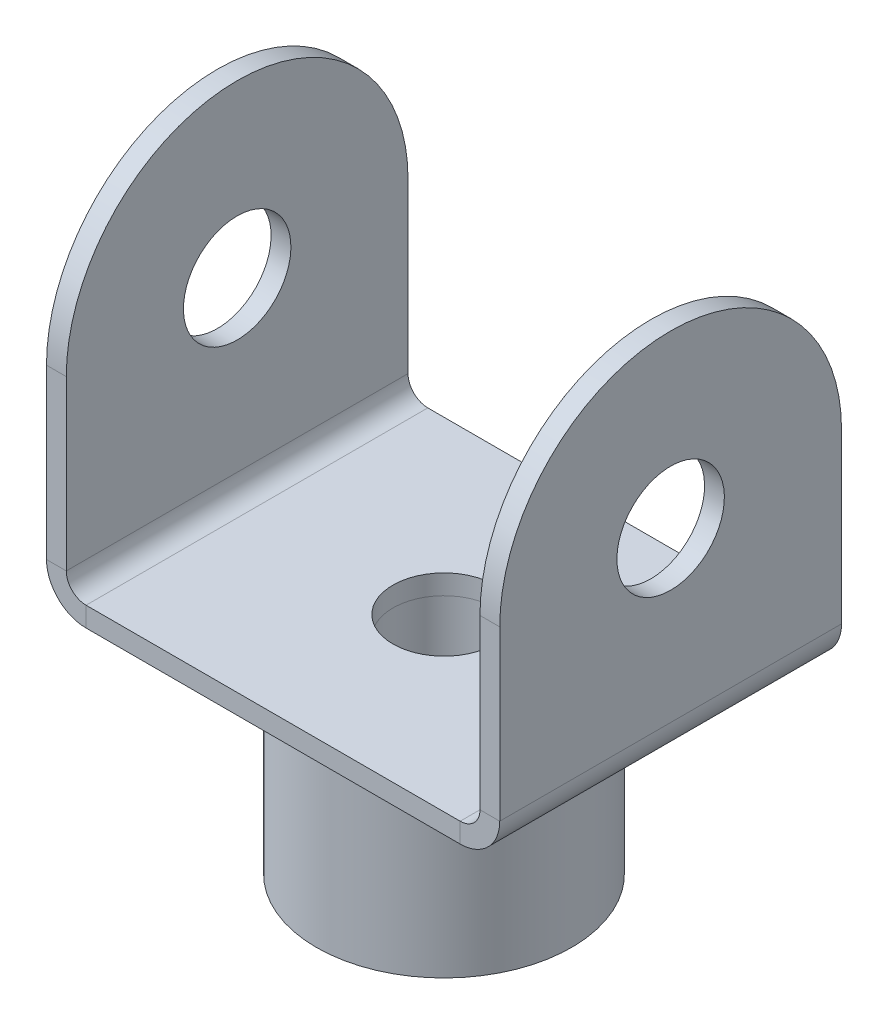
ISO-10303-21;
HEADER;
FILE_DESCRIPTION(('STEP AP214'),'2;1');
FILE_NAME('part.step','',(''),(''),'','','');
FILE_SCHEMA(('AUTOMOTIVE_DESIGN { 1 0 10303 214 1 1 1 1 }'));
ENDSEC;
DATA;
#1=APPLICATION_CONTEXT('core data for automotive mechanical design processes');
#2=APPLICATION_PROTOCOL_DEFINITION('international standard','automotive_design',2000,#1);
#3=PRODUCT_CONTEXT('',#1,'mechanical');
#4=PRODUCT('Part','Part','',(#3));
#5=PRODUCT_RELATED_PRODUCT_CATEGORY('part','',(#4));
#6=PRODUCT_DEFINITION_FORMATION('','',#4);
#7=PRODUCT_DEFINITION_CONTEXT('part definition',#1,'design');
#8=PRODUCT_DEFINITION('design','',#6,#7);
#9=PRODUCT_DEFINITION_SHAPE('','',#8);
#10=(LENGTH_UNIT() NAMED_UNIT(*) SI_UNIT(.MILLI.,.METRE.));
#11=(NAMED_UNIT(*) PLANE_ANGLE_UNIT() SI_UNIT($,.RADIAN.));
#12=(NAMED_UNIT(*) SI_UNIT($,.STERADIAN.) SOLID_ANGLE_UNIT());
#13=UNCERTAINTY_MEASURE_WITH_UNIT(LENGTH_MEASURE(1.E-05),#10,'distance_accuracy_value','');
#14=(GEOMETRIC_REPRESENTATION_CONTEXT(3) GLOBAL_UNCERTAINTY_ASSIGNED_CONTEXT((#13)) GLOBAL_UNIT_ASSIGNED_CONTEXT((#10,
#11,#12)) REPRESENTATION_CONTEXT('',''));
#15=CARTESIAN_POINT('',(0.,0.,0.));
#16=DIRECTION('',(0.,0.,1.));
#17=DIRECTION('',(1.,0.,0.));
#18=AXIS2_PLACEMENT_3D('',#15,#16,#17);
#19=CARTESIAN_POINT('',(0.,8.3566,0.));
#20=DIRECTION('',(0.,-1.,0.));
#21=DIRECTION('',(0.,0.,-1.));
#22=AXIS2_PLACEMENT_3D('',#19,#20,#21);
#23=PLANE('',#22);
#24=CARTESIAN_POINT('',(0.,8.3566,0.));
#25=DIRECTION('',(0.,1.,0.));
#26=DIRECTION('',(0.,0.,1.));
#27=AXIS2_PLACEMENT_3D('',#24,#25,#26);
#28=CIRCLE('',#27,1.9);
#29=CARTESIAN_POINT('',(0.,8.3566,1.9));
#30=VERTEX_POINT('',#29);
#31=EDGE_CURVE('E301',#30,#30,#28,.T.);
#32=ORIENTED_EDGE('',*,*,#31,.F.);
#33=EDGE_LOOP('',(#32));
#34=FACE_BOUND('',#33,.T.);
#35=DIRECTION('',(0.,0.,-1.));
#36=VECTOR('',#35,1.);
#37=CARTESIAN_POINT('',(6.9618,8.35659999999999,-6.36));
#38=LINE('',#37,#36);
#39=CARTESIAN_POINT('',(6.9618,8.35659999999999,-6.36));
#40=VERTEX_POINT('',#39);
#41=CARTESIAN_POINT('',(6.9618,8.35660000000001,6.36));
#42=VERTEX_POINT('',#41);
#43=EDGE_CURVE('E232',#40,#42,#38,.F.);
#44=ORIENTED_EDGE('',*,*,#43,.F.);
#45=DIRECTION('',(-1.,0.,0.));
#46=VECTOR('',#45,1.);
#47=CARTESIAN_POINT('',(7.435,8.3566,-6.36));
#48=LINE('',#47,#46);
#49=CARTESIAN_POINT('',(-6.9618,8.35660000000001,-6.36));
#50=VERTEX_POINT('',#49);
#51=EDGE_CURVE('E14',#40,#50,#48,.T.);
#52=ORIENTED_EDGE('',*,*,#51,.T.);
#53=DIRECTION('',(0.,0.,1.));
#54=VECTOR('',#53,1.);
#55=CARTESIAN_POINT('',(-6.9618,8.35659999999999,6.36));
#56=LINE('',#55,#54);
#57=CARTESIAN_POINT('',(-6.9618,8.35659999999999,6.36));
#58=VERTEX_POINT('',#57);
#59=EDGE_CURVE('E290',#58,#50,#56,.F.);
#60=ORIENTED_EDGE('',*,*,#59,.F.);
#61=DIRECTION('',(1.,0.,0.));
#62=VECTOR('',#61,1.);
#63=CARTESIAN_POINT('',(7.435,8.3566,6.36));
#64=LINE('',#63,#62);
#65=EDGE_CURVE('E91',#58,#42,#64,.T.);
#66=ORIENTED_EDGE('',*,*,#65,.T.);
#67=EDGE_LOOP('',(#44,#52,#60,#66));
#68=FACE_BOUND('',#67,.T.);
#69=ADVANCED_FACE('F82',(#34,#68),#23,.F.);
#70=CARTESIAN_POINT('',(0.,7.62,0.));
#71=DIRECTION('',(0.,-1.,0.));
#72=DIRECTION('',(0.,0.,-1.));
#73=AXIS2_PLACEMENT_3D('',#70,#71,#72);
#74=PLANE('',#73);
#75=CARTESIAN_POINT('',(0.,7.62,0.));
#76=DIRECTION('',(0.,1.,0.));
#77=DIRECTION('',(0.,0.,1.));
#78=AXIS2_PLACEMENT_3D('',#75,#76,#77);
#79=CIRCLE('',#78,1.9);
#80=CARTESIAN_POINT('',(0.,7.62,1.9));
#81=VERTEX_POINT('',#80);
#82=EDGE_CURVE('E298',#81,#81,#79,.T.);
#83=ORIENTED_EDGE('',*,*,#82,.T.);
#84=EDGE_LOOP('',(#83));
#85=FACE_BOUND('',#84,.T.);
#86=DIRECTION('',(-1.,0.,0.));
#87=VECTOR('',#86,1.);
#88=CARTESIAN_POINT('',(7.435,7.62,-6.36));
#89=LINE('',#88,#87);
#90=CARTESIAN_POINT('',(6.9618,7.61999999999999,-6.36));
#91=VERTEX_POINT('',#90);
#92=CARTESIAN_POINT('',(-6.9618,7.62,-6.36));
#93=VERTEX_POINT('',#92);
#94=EDGE_CURVE('E86',#91,#93,#89,.T.);
#95=ORIENTED_EDGE('',*,*,#94,.F.);
#96=DIRECTION('',(0.,0.,-1.));
#97=VECTOR('',#96,1.);
#98=CARTESIAN_POINT('',(6.9618,7.61999999999999,-6.36));
#99=LINE('',#98,#97);
#100=CARTESIAN_POINT('',(6.9618,7.62,6.36));
#101=VERTEX_POINT('',#100);
#102=EDGE_CURVE('E221',#91,#101,#99,.F.);
#103=ORIENTED_EDGE('',*,*,#102,.T.);
#104=DIRECTION('',(1.,0.,0.));
#105=VECTOR('',#104,1.);
#106=CARTESIAN_POINT('',(7.435,7.62,6.36));
#107=LINE('',#106,#105);
#108=CARTESIAN_POINT('',(-6.9618,7.61999999999999,6.36));
#109=VERTEX_POINT('',#108);
#110=EDGE_CURVE('E304',#109,#101,#107,.T.);
#111=ORIENTED_EDGE('',*,*,#110,.F.);
#112=DIRECTION('',(0.,0.,1.));
#113=VECTOR('',#112,1.);
#114=CARTESIAN_POINT('',(-6.9618,7.61999999999999,6.36));
#115=LINE('',#114,#113);
#116=EDGE_CURVE('E277',#109,#93,#115,.F.);
#117=ORIENTED_EDGE('',*,*,#116,.T.);
#118=EDGE_LOOP('',(#95,#103,#111,#117));
#119=FACE_BOUND('',#118,.T.);
#120=ADVANCED_FACE('F314',(#85,#119),#74,.T.);
#121=CARTESIAN_POINT('',(7.435,8.3566,6.36));
#122=DIRECTION('',(0.,0.,-1.));
#123=DIRECTION('',(-1.,0.,0.));
#124=AXIS2_PLACEMENT_3D('',#121,#122,#123);
#125=PLANE('',#124);
#126=DIRECTION('',(0.,-1.,0.));
#127=VECTOR('',#126,1.);
#128=CARTESIAN_POINT('',(6.9618,8.35660000000001,6.36));
#129=LINE('',#128,#127);
#130=EDGE_CURVE('E237',#42,#101,#129,.T.);
#131=ORIENTED_EDGE('',*,*,#130,.F.);
#132=ORIENTED_EDGE('',*,*,#65,.F.);
#133=DIRECTION('',(0.,-1.,0.));
#134=VECTOR('',#133,1.);
#135=CARTESIAN_POINT('',(-6.9618,8.35659999999999,6.36));
#136=LINE('',#135,#134);
#137=EDGE_CURVE('E284',#58,#109,#136,.T.);
#138=ORIENTED_EDGE('',*,*,#137,.T.);
#139=ORIENTED_EDGE('',*,*,#110,.T.);
#140=EDGE_LOOP('',(#131,#132,#138,#139));
#141=FACE_BOUND('',#140,.T.);
#142=ADVANCED_FACE('F84',(#141),#125,.F.);
#143=CARTESIAN_POINT('',(7.435,8.3566,-6.36));
#144=DIRECTION('',(0.,0.,1.));
#145=DIRECTION('',(1.,0.,0.));
#146=AXIS2_PLACEMENT_3D('',#143,#144,#145);
#147=PLANE('',#146);
#148=DIRECTION('',(0.,-1.,0.));
#149=VECTOR('',#148,1.);
#150=CARTESIAN_POINT('',(6.9618,8.35659999999999,-6.36));
#151=LINE('',#150,#149);
#152=EDGE_CURVE('E226',#40,#91,#151,.T.);
#153=ORIENTED_EDGE('',*,*,#152,.T.);
#154=ORIENTED_EDGE('',*,*,#94,.T.);
#155=DIRECTION('',(0.,-1.,0.));
#156=VECTOR('',#155,1.);
#157=CARTESIAN_POINT('',(-6.9618,8.35660000000001,-6.36));
#158=LINE('',#157,#156);
#159=EDGE_CURVE('E295',#50,#93,#158,.T.);
#160=ORIENTED_EDGE('',*,*,#159,.F.);
#161=ORIENTED_EDGE('',*,*,#51,.F.);
#162=EDGE_LOOP('',(#153,#154,#160,#161));
#163=FACE_BOUND('',#162,.T.);
#164=ADVANCED_FACE('F321',(#163),#147,.F.);
#165=CARTESIAN_POINT('',(0.,8.3566,0.));
#166=DIRECTION('',(0.,-1.,0.));
#167=DIRECTION('',(0.,0.,-1.));
#168=AXIS2_PLACEMENT_3D('',#165,#166,#167);
#169=CYLINDRICAL_SURFACE('',#168,1.9);
#170=ORIENTED_EDGE('',*,*,#31,.T.);
#171=EDGE_LOOP('',(#170));
#172=FACE_BOUND('',#171,.T.);
#173=ORIENTED_EDGE('',*,*,#82,.F.);
#174=EDGE_LOOP('',(#173));
#175=FACE_BOUND('',#174,.T.);
#176=ADVANCED_FACE('F353',(#172,#175),#169,.F.);
#177=CARTESIAN_POINT('',(-6.9618,9.09320000000001,-6.36));
#178=DIRECTION('',(0.,0.,-1.));
#179=DIRECTION('',(0.,1.,0.));
#180=AXIS2_PLACEMENT_3D('',#177,#178,#179);
#181=PLANE('',#180);
#182=DIRECTION('',(1.,0.,0.));
#183=VECTOR('',#182,1.);
#184=CARTESIAN_POINT('',(-8.435,9.0932,-6.36));
#185=LINE('',#184,#183);
#186=CARTESIAN_POINT('',(-7.6984,9.09320000000001,-6.36));
#187=VERTEX_POINT('',#186);
#188=CARTESIAN_POINT('',(-8.43500000000001,9.09320000000001,-6.36));
#189=VERTEX_POINT('',#188);
#190=EDGE_CURVE('E239',#187,#189,#185,.F.);
#191=ORIENTED_EDGE('',*,*,#190,.F.);
#192=CARTESIAN_POINT('',(-6.9618,9.09320000000001,-6.36));
#193=DIRECTION('',(0.,0.,1.));
#194=DIRECTION('',(0.,-1.,0.));
#195=AXIS2_PLACEMENT_3D('',#192,#193,#194);
#196=CIRCLE('',#195,0.736600000000001);
#197=EDGE_CURVE('E287',#50,#187,#196,.F.);
#198=ORIENTED_EDGE('',*,*,#197,.F.);
#199=ORIENTED_EDGE('',*,*,#159,.T.);
#200=CARTESIAN_POINT('',(-6.9618,9.09320000000001,-6.36));
#201=DIRECTION('',(0.,0.,1.));
#202=DIRECTION('',(0.,-1.,0.));
#203=AXIS2_PLACEMENT_3D('',#200,#201,#202);
#204=CIRCLE('',#203,1.4732);
#205=EDGE_CURVE('E280',#93,#189,#204,.F.);
#206=ORIENTED_EDGE('',*,*,#205,.T.);
#207=EDGE_LOOP('',(#191,#198,#199,#206));
#208=FACE_BOUND('',#207,.T.);
#209=ADVANCED_FACE('F360',(#208),#181,.T.);
#210=CARTESIAN_POINT('',(-6.9618,9.09319999999999,6.36));
#211=DIRECTION('',(0.,0.,-1.));
#212=DIRECTION('',(0.,1.,0.));
#213=AXIS2_PLACEMENT_3D('',#210,#211,#212);
#214=PLANE('',#213);
#215=CARTESIAN_POINT('',(-6.9618,9.09319999999999,6.36));
#216=DIRECTION('',(0.,0.,1.));
#217=DIRECTION('',(0.,-1.,0.));
#218=AXIS2_PLACEMENT_3D('',#215,#216,#217);
#219=CIRCLE('',#218,0.736600000000001);
#220=CARTESIAN_POINT('',(-7.6984,9.09319999999999,6.36));
#221=VERTEX_POINT('',#220);
#222=EDGE_CURVE('E248',#221,#58,#219,.T.);
#223=ORIENTED_EDGE('',*,*,#222,.F.);
#224=DIRECTION('',(1.,0.,0.));
#225=VECTOR('',#224,1.);
#226=CARTESIAN_POINT('',(-7.6984,9.0932,6.36));
#227=LINE('',#226,#225);
#228=CARTESIAN_POINT('',(-8.435,9.09319999999999,6.36));
#229=VERTEX_POINT('',#228);
#230=EDGE_CURVE('E270',#221,#229,#227,.F.);
#231=ORIENTED_EDGE('',*,*,#230,.T.);
#232=CARTESIAN_POINT('',(-6.9618,9.09319999999999,6.36));
#233=DIRECTION('',(0.,0.,1.));
#234=DIRECTION('',(0.,-1.,0.));
#235=AXIS2_PLACEMENT_3D('',#232,#233,#234);
#236=CIRCLE('',#235,1.4732);
#237=EDGE_CURVE('E281',#229,#109,#236,.T.);
#238=ORIENTED_EDGE('',*,*,#237,.T.);
#239=ORIENTED_EDGE('',*,*,#137,.F.);
#240=EDGE_LOOP('',(#223,#231,#238,#239));
#241=FACE_BOUND('',#240,.T.);
#242=ADVANCED_FACE('F458',(#241),#214,.F.);
#243=CARTESIAN_POINT('',(-6.9618,9.09319999999999,6.36));
#244=DIRECTION('',(0.,0.,1.));
#245=DIRECTION('',(-1.,0.,0.));
#246=AXIS2_PLACEMENT_3D('',#243,#244,#245);
#247=CYLINDRICAL_SURFACE('',#246,1.4732);
#248=ORIENTED_EDGE('',*,*,#116,.F.);
#249=ORIENTED_EDGE('',*,*,#237,.F.);
#250=DIRECTION('',(0.,0.,1.));
#251=VECTOR('',#250,1.);
#252=CARTESIAN_POINT('',(-8.43500000000001,9.0932,-6.36));
#253=LINE('',#252,#251);
#254=EDGE_CURVE('E268',#229,#189,#253,.F.);
#255=ORIENTED_EDGE('',*,*,#254,.T.);
#256=ORIENTED_EDGE('',*,*,#205,.F.);
#257=EDGE_LOOP('',(#248,#249,#255,#256));
#258=FACE_BOUND('',#257,.T.);
#259=ADVANCED_FACE('F447',(#258),#247,.T.);
#260=CARTESIAN_POINT('',(-6.9618,9.09319999999999,6.36));
#261=DIRECTION('',(0.,0.,1.));
#262=DIRECTION('',(-1.,0.,0.));
#263=AXIS2_PLACEMENT_3D('',#260,#261,#262);
#264=CYLINDRICAL_SURFACE('',#263,0.736600000000001);
#265=ORIENTED_EDGE('',*,*,#59,.T.);
#266=ORIENTED_EDGE('',*,*,#197,.T.);
#267=DIRECTION('',(0.,0.,1.));
#268=VECTOR('',#267,1.);
#269=CARTESIAN_POINT('',(-7.6984,9.0932,-6.36));
#270=LINE('',#269,#268);
#271=EDGE_CURVE('E273',#187,#221,#270,.T.);
#272=ORIENTED_EDGE('',*,*,#271,.T.);
#273=ORIENTED_EDGE('',*,*,#222,.T.);
#274=EDGE_LOOP('',(#265,#266,#272,#273));
#275=FACE_BOUND('',#274,.T.);
#276=ADVANCED_FACE('F436',(#275),#264,.F.);
#277=CARTESIAN_POINT('',(-8.43500000000003,15.3566,0.));
#278=DIRECTION('',(1.,0.,0.));
#279=DIRECTION('',(0.,1.,0.));
#280=AXIS2_PLACEMENT_3D('',#277,#278,#279);
#281=PLANE('',#280);
#282=CARTESIAN_POINT('',(-8.43500000000003,15.3566,0.));
#283=DIRECTION('',(1.,0.,0.));
#284=DIRECTION('',(0.,1.,0.));
#285=AXIS2_PLACEMENT_3D('',#282,#283,#284);
#286=CIRCLE('',#285,2.);
#287=CARTESIAN_POINT('',(-8.43500000000003,17.3566,0.));
#288=VERTEX_POINT('',#287);
#289=EDGE_CURVE('E262',#288,#288,#286,.F.);
#290=ORIENTED_EDGE('',*,*,#289,.F.);
#291=EDGE_LOOP('',(#290));
#292=FACE_BOUND('',#291,.T.);
#293=ORIENTED_EDGE('',*,*,#254,.F.);
#294=DIRECTION('',(0.,1.,0.));
#295=VECTOR('',#294,1.);
#296=CARTESIAN_POINT('',(-8.43500000000003,15.3566,6.36));
#297=LINE('',#296,#295);
#298=CARTESIAN_POINT('',(-8.43500000000003,15.3566,6.36));
#299=VERTEX_POINT('',#298);
#300=EDGE_CURVE('E250',#229,#299,#297,.T.);
#301=ORIENTED_EDGE('',*,*,#300,.T.);
#302=CARTESIAN_POINT('',(-8.43500000000003,15.3566,0.));
#303=DIRECTION('',(1.,0.,0.));
#304=DIRECTION('',(0.,1.,0.));
#305=AXIS2_PLACEMENT_3D('',#302,#303,#304);
#306=CIRCLE('',#305,6.36);
#307=CARTESIAN_POINT('',(-8.43500000000003,15.3566,-6.36));
#308=VERTEX_POINT('',#307);
#309=EDGE_CURVE('E245',#299,#308,#306,.F.);
#310=ORIENTED_EDGE('',*,*,#309,.T.);
#311=DIRECTION('',(0.,-1.,0.));
#312=VECTOR('',#311,1.);
#313=CARTESIAN_POINT('',(-8.43500000000003,15.3566,-6.36));
#314=LINE('',#313,#312);
#315=EDGE_CURVE('E252',#308,#189,#314,.T.);
#316=ORIENTED_EDGE('',*,*,#315,.T.);
#317=EDGE_LOOP('',(#293,#301,#310,#316));
#318=FACE_BOUND('',#317,.T.);
#319=ADVANCED_FACE('F425',(#292,#318),#281,.F.);
#320=CARTESIAN_POINT('',(-7.69840000000003,15.3566,0.));
#321=DIRECTION('',(1.,0.,0.));
#322=DIRECTION('',(0.,1.,0.));
#323=AXIS2_PLACEMENT_3D('',#320,#321,#322);
#324=PLANE('',#323);
#325=CARTESIAN_POINT('',(-7.69840000000003,15.3566,0.));
#326=DIRECTION('',(1.,0.,0.));
#327=DIRECTION('',(0.,1.,0.));
#328=AXIS2_PLACEMENT_3D('',#325,#326,#327);
#329=CIRCLE('',#328,2.);
#330=CARTESIAN_POINT('',(-7.69840000000003,17.3566,0.));
#331=VERTEX_POINT('',#330);
#332=EDGE_CURVE('E265',#331,#331,#329,.F.);
#333=ORIENTED_EDGE('',*,*,#332,.T.);
#334=EDGE_LOOP('',(#333));
#335=FACE_BOUND('',#334,.T.);
#336=DIRECTION('',(0.,-1.,0.));
#337=VECTOR('',#336,1.);
#338=CARTESIAN_POINT('',(-7.69840000000002,15.3566,6.36));
#339=LINE('',#338,#337);
#340=CARTESIAN_POINT('',(-7.69840000000002,15.3566,6.36));
#341=VERTEX_POINT('',#340);
#342=EDGE_CURVE('E257',#221,#341,#339,.F.);
#343=ORIENTED_EDGE('',*,*,#342,.F.);
#344=ORIENTED_EDGE('',*,*,#271,.F.);
#345=DIRECTION('',(0.,1.,0.));
#346=VECTOR('',#345,1.);
#347=CARTESIAN_POINT('',(-7.6984,8.3566,-6.36));
#348=LINE('',#347,#346);
#349=CARTESIAN_POINT('',(-7.69840000000003,15.3566,-6.36));
#350=VERTEX_POINT('',#349);
#351=EDGE_CURVE('E259',#350,#187,#348,.F.);
#352=ORIENTED_EDGE('',*,*,#351,.F.);
#353=CARTESIAN_POINT('',(-7.69840000000003,15.3566,0.));
#354=DIRECTION('',(1.,0.,0.));
#355=DIRECTION('',(0.,1.,0.));
#356=AXIS2_PLACEMENT_3D('',#353,#354,#355);
#357=CIRCLE('',#356,6.36);
#358=EDGE_CURVE('E255',#341,#350,#357,.F.);
#359=ORIENTED_EDGE('',*,*,#358,.F.);
#360=EDGE_LOOP('',(#343,#344,#352,#359));
#361=FACE_BOUND('',#360,.T.);
#362=ADVANCED_FACE('F414',(#335,#361),#324,.T.);
#363=CARTESIAN_POINT('',(-8.435,8.3566,-6.36));
#364=DIRECTION('',(0.,0.,1.));
#365=DIRECTION('',(1.,0.,0.));
#366=AXIS2_PLACEMENT_3D('',#363,#364,#365);
#367=PLANE('',#366);
#368=ORIENTED_EDGE('',*,*,#190,.T.);
#369=ORIENTED_EDGE('',*,*,#315,.F.);
#370=DIRECTION('',(1.,0.,0.));
#371=VECTOR('',#370,1.);
#372=CARTESIAN_POINT('',(-8.43500000000003,15.3566,-6.36));
#373=LINE('',#372,#371);
#374=EDGE_CURVE('E241',#308,#350,#373,.T.);
#375=ORIENTED_EDGE('',*,*,#374,.T.);
#376=ORIENTED_EDGE('',*,*,#351,.T.);
#377=EDGE_LOOP('',(#368,#369,#375,#376));
#378=FACE_BOUND('',#377,.T.);
#379=ADVANCED_FACE('F403',(#378),#367,.F.);
#380=CARTESIAN_POINT('',(-8.43500000000002,15.3566,6.36));
#381=DIRECTION('',(0.,0.,-1.));
#382=DIRECTION('',(-1.,0.,0.));
#383=AXIS2_PLACEMENT_3D('',#380,#381,#382);
#384=PLANE('',#383);
#385=ORIENTED_EDGE('',*,*,#230,.F.);
#386=ORIENTED_EDGE('',*,*,#342,.T.);
#387=DIRECTION('',(1.,0.,0.));
#388=VECTOR('',#387,1.);
#389=CARTESIAN_POINT('',(-8.43500000000002,15.3566,6.36));
#390=LINE('',#389,#388);
#391=EDGE_CURVE('E244',#299,#341,#390,.T.);
#392=ORIENTED_EDGE('',*,*,#391,.F.);
#393=ORIENTED_EDGE('',*,*,#300,.F.);
#394=EDGE_LOOP('',(#385,#386,#392,#393));
#395=FACE_BOUND('',#394,.T.);
#396=ADVANCED_FACE('F392',(#395),#384,.F.);
#397=CARTESIAN_POINT('',(-8.43500000000003,15.3566,0.));
#398=DIRECTION('',(1.,0.,0.));
#399=DIRECTION('',(0.,1.,0.));
#400=AXIS2_PLACEMENT_3D('',#397,#398,#399);
#401=CYLINDRICAL_SURFACE('',#400,6.36);
#402=ORIENTED_EDGE('',*,*,#358,.T.);
#403=ORIENTED_EDGE('',*,*,#374,.F.);
#404=ORIENTED_EDGE('',*,*,#309,.F.);
#405=ORIENTED_EDGE('',*,*,#391,.T.);
#406=EDGE_LOOP('',(#402,#403,#404,#405));
#407=FACE_BOUND('',#406,.T.);
#408=ADVANCED_FACE('F339',(#407),#401,.T.);
#409=CARTESIAN_POINT('',(-8.43500000000003,15.3566,0.));
#410=DIRECTION('',(1.,0.,0.));
#411=DIRECTION('',(0.,1.,0.));
#412=AXIS2_PLACEMENT_3D('',#409,#410,#411);
#413=CYLINDRICAL_SURFACE('',#412,2.);
#414=ORIENTED_EDGE('',*,*,#289,.T.);
#415=EDGE_LOOP('',(#414));
#416=FACE_BOUND('',#415,.T.);
#417=ORIENTED_EDGE('',*,*,#332,.F.);
#418=EDGE_LOOP('',(#417));
#419=FACE_BOUND('',#418,.T.);
#420=ADVANCED_FACE('F332',(#416,#419),#413,.F.);
#421=CARTESIAN_POINT('',(6.9618,9.09320000000001,6.36));
#422=DIRECTION('',(0.,0.,1.));
#423=DIRECTION('',(0.,-1.,0.));
#424=AXIS2_PLACEMENT_3D('',#421,#422,#423);
#425=PLANE('',#424);
#426=DIRECTION('',(1.,0.,0.));
#427=VECTOR('',#426,1.);
#428=CARTESIAN_POINT('',(8.435,9.0932,6.36));
#429=LINE('',#428,#427);
#430=CARTESIAN_POINT('',(7.6984,9.09320000000001,6.36));
#431=VERTEX_POINT('',#430);
#432=CARTESIAN_POINT('',(8.435,9.09320000000001,6.36));
#433=VERTEX_POINT('',#432);
#434=EDGE_CURVE('E180',#431,#433,#429,.T.);
#435=ORIENTED_EDGE('',*,*,#434,.F.);
#436=CARTESIAN_POINT('',(6.9618,9.09320000000001,6.36));
#437=DIRECTION('',(0.,0.,-1.));
#438=DIRECTION('',(0.,1.,0.));
#439=AXIS2_PLACEMENT_3D('',#436,#437,#438);
#440=CIRCLE('',#439,0.7366);
#441=EDGE_CURVE('E229',#42,#431,#440,.F.);
#442=ORIENTED_EDGE('',*,*,#441,.F.);
#443=ORIENTED_EDGE('',*,*,#130,.T.);
#444=CARTESIAN_POINT('',(6.9618,9.09320000000001,6.36));
#445=DIRECTION('',(0.,0.,-1.));
#446=DIRECTION('',(0.,1.,0.));
#447=AXIS2_PLACEMENT_3D('',#444,#445,#446);
#448=CIRCLE('',#447,1.4732);
#449=EDGE_CURVE('E99',#101,#433,#448,.F.);
#450=ORIENTED_EDGE('',*,*,#449,.T.);
#451=EDGE_LOOP('',(#435,#442,#443,#450));
#452=FACE_BOUND('',#451,.T.);
#453=ADVANCED_FACE('F330',(#452),#425,.T.);
#454=CARTESIAN_POINT('',(6.9618,9.09319999999999,-6.36));
#455=DIRECTION('',(0.,0.,1.));
#456=DIRECTION('',(0.,-1.,0.));
#457=AXIS2_PLACEMENT_3D('',#454,#455,#456);
#458=PLANE('',#457);
#459=CARTESIAN_POINT('',(6.9618,9.09319999999999,-6.36));
#460=DIRECTION('',(0.,0.,-1.));
#461=DIRECTION('',(0.,1.,0.));
#462=AXIS2_PLACEMENT_3D('',#459,#460,#461);
#463=CIRCLE('',#462,0.7366);
#464=CARTESIAN_POINT('',(7.6984,9.09319999999999,-6.36));
#465=VERTEX_POINT('',#464);
#466=EDGE_CURVE('E234',#465,#40,#463,.T.);
#467=ORIENTED_EDGE('',*,*,#466,.F.);
#468=DIRECTION('',(1.,0.,0.));
#469=VECTOR('',#468,1.);
#470=CARTESIAN_POINT('',(7.6984,9.0932,-6.36));
#471=LINE('',#470,#469);
#472=CARTESIAN_POINT('',(8.43500000000001,9.09319999999999,-6.36));
#473=VERTEX_POINT('',#472);
#474=EDGE_CURVE('E215',#465,#473,#471,.T.);
#475=ORIENTED_EDGE('',*,*,#474,.T.);
#476=CARTESIAN_POINT('',(6.9618,9.09319999999999,-6.36));
#477=DIRECTION('',(0.,0.,-1.));
#478=DIRECTION('',(0.,1.,0.));
#479=AXIS2_PLACEMENT_3D('',#476,#477,#478);
#480=CIRCLE('',#479,1.4732);
#481=EDGE_CURVE('E224',#473,#91,#480,.T.);
#482=ORIENTED_EDGE('',*,*,#481,.T.);
#483=ORIENTED_EDGE('',*,*,#152,.F.);
#484=EDGE_LOOP('',(#467,#475,#482,#483));
#485=FACE_BOUND('',#484,.T.);
#486=ADVANCED_FACE('F318',(#485),#458,.F.);
#487=CARTESIAN_POINT('',(6.9618,9.09319999999999,-6.36));
#488=DIRECTION('',(0.,0.,-1.));
#489=DIRECTION('',(1.,0.,0.));
#490=AXIS2_PLACEMENT_3D('',#487,#488,#489);
#491=CYLINDRICAL_SURFACE('',#490,1.4732);
#492=ORIENTED_EDGE('',*,*,#102,.F.);
#493=ORIENTED_EDGE('',*,*,#481,.F.);
#494=DIRECTION('',(0.,0.,-1.));
#495=VECTOR('',#494,1.);
#496=CARTESIAN_POINT('',(8.435,9.0932,6.36));
#497=LINE('',#496,#495);
#498=EDGE_CURVE('E213',#473,#433,#497,.F.);
#499=ORIENTED_EDGE('',*,*,#498,.T.);
#500=ORIENTED_EDGE('',*,*,#449,.F.);
#501=EDGE_LOOP('',(#492,#493,#499,#500));
#502=FACE_BOUND('',#501,.T.);
#503=ADVANCED_FACE('F315',(#502),#491,.T.);
#504=CARTESIAN_POINT('',(6.9618,9.09319999999999,-6.36));
#505=DIRECTION('',(0.,0.,-1.));
#506=DIRECTION('',(1.,0.,0.));
#507=AXIS2_PLACEMENT_3D('',#504,#505,#506);
#508=CYLINDRICAL_SURFACE('',#507,0.7366);
#509=ORIENTED_EDGE('',*,*,#43,.T.);
#510=ORIENTED_EDGE('',*,*,#441,.T.);
#511=DIRECTION('',(0.,0.,-1.));
#512=VECTOR('',#511,1.);
#513=CARTESIAN_POINT('',(7.6984,9.0932,6.36));
#514=LINE('',#513,#512);
#515=EDGE_CURVE('E218',#431,#465,#514,.T.);
#516=ORIENTED_EDGE('',*,*,#515,.T.);
#517=ORIENTED_EDGE('',*,*,#466,.T.);
#518=EDGE_LOOP('',(#509,#510,#516,#517));
#519=FACE_BOUND('',#518,.T.);
#520=ADVANCED_FACE('F327',(#519),#508,.F.);
#521=CARTESIAN_POINT('',(8.435,8.3566,-6.36));
#522=DIRECTION('',(0.,0.,-1.));
#523=DIRECTION('',(-1.,0.,0.));
#524=AXIS2_PLACEMENT_3D('',#521,#522,#523);
#525=PLANE('',#524);
#526=DIRECTION('',(0.,1.,0.));
#527=VECTOR('',#526,1.);
#528=CARTESIAN_POINT('',(8.435,8.3566,-6.36));
#529=LINE('',#528,#527);
#530=CARTESIAN_POINT('',(8.43500000000003,15.3566,-6.36));
#531=VERTEX_POINT('',#530);
#532=EDGE_CURVE('E196',#531,#473,#529,.F.);
#533=ORIENTED_EDGE('',*,*,#532,.T.);
#534=ORIENTED_EDGE('',*,*,#474,.F.);
#535=DIRECTION('',(0.,-1.,0.));
#536=VECTOR('',#535,1.);
#537=CARTESIAN_POINT('',(7.69840000000003,15.3566,-6.36));
#538=LINE('',#537,#536);
#539=CARTESIAN_POINT('',(7.69840000000003,15.3566,-6.36));
#540=VERTEX_POINT('',#539);
#541=EDGE_CURVE('E204',#540,#465,#538,.T.);
#542=ORIENTED_EDGE('',*,*,#541,.F.);
#543=DIRECTION('',(-1.,0.,0.));
#544=VECTOR('',#543,1.);
#545=CARTESIAN_POINT('',(8.43500000000003,15.3566,-6.36));
#546=LINE('',#545,#544);
#547=EDGE_CURVE('E191',#531,#540,#546,.T.);
#548=ORIENTED_EDGE('',*,*,#547,.F.);
#549=EDGE_LOOP('',(#533,#534,#542,#548));
#550=FACE_BOUND('',#549,.T.);
#551=ADVANCED_FACE('F534',(#550),#525,.T.);
#552=CARTESIAN_POINT('',(8.43500000000002,15.3566,6.36));
#553=DIRECTION('',(0.,0.,1.));
#554=DIRECTION('',(1.,0.,0.));
#555=AXIS2_PLACEMENT_3D('',#552,#553,#554);
#556=PLANE('',#555);
#557=DIRECTION('',(0.,1.,0.));
#558=VECTOR('',#557,1.);
#559=CARTESIAN_POINT('',(7.69840000000002,15.3566,6.36));
#560=LINE('',#559,#558);
#561=CARTESIAN_POINT('',(7.69840000000002,15.3566,6.36));
#562=VERTEX_POINT('',#561);
#563=EDGE_CURVE('E198',#431,#562,#560,.T.);
#564=ORIENTED_EDGE('',*,*,#563,.F.);
#565=ORIENTED_EDGE('',*,*,#434,.T.);
#566=DIRECTION('',(0.,-1.,0.));
#567=VECTOR('',#566,1.);
#568=CARTESIAN_POINT('',(8.43500000000003,15.3566,6.36));
#569=LINE('',#568,#567);
#570=CARTESIAN_POINT('',(8.43500000000003,15.3566,6.36));
#571=VERTEX_POINT('',#570);
#572=EDGE_CURVE('E174',#433,#571,#569,.F.);
#573=ORIENTED_EDGE('',*,*,#572,.T.);
#574=DIRECTION('',(-1.,0.,0.));
#575=VECTOR('',#574,1.);
#576=CARTESIAN_POINT('',(8.43500000000002,15.3566,6.36));
#577=LINE('',#576,#575);
#578=EDGE_CURVE('E178',#571,#562,#577,.T.);
#579=ORIENTED_EDGE('',*,*,#578,.T.);
#580=EDGE_LOOP('',(#564,#565,#573,#579));
#581=FACE_BOUND('',#580,.T.);
#582=ADVANCED_FACE('F177',(#581),#556,.T.);
#583=CARTESIAN_POINT('',(8.43500000000003,15.3566,0.));
#584=DIRECTION('',(-1.,0.,0.));
#585=DIRECTION('',(0.,1.,0.));
#586=AXIS2_PLACEMENT_3D('',#583,#584,#585);
#587=PLANE('',#586);
#588=CARTESIAN_POINT('',(8.43500000000003,15.3566,0.));
#589=DIRECTION('',(-1.,0.,0.));
#590=DIRECTION('',(0.,-1.,0.));
#591=AXIS2_PLACEMENT_3D('',#588,#589,#590);
#592=CIRCLE('',#591,2.);
#593=CARTESIAN_POINT('',(8.43500000000002,13.3566,0.));
#594=VERTEX_POINT('',#593);
#595=EDGE_CURVE('E207',#594,#594,#592,.T.);
#596=ORIENTED_EDGE('',*,*,#595,.T.);
#597=EDGE_LOOP('',(#596));
#598=FACE_BOUND('',#597,.T.);
#599=ORIENTED_EDGE('',*,*,#498,.F.);
#600=ORIENTED_EDGE('',*,*,#532,.F.);
#601=CARTESIAN_POINT('',(8.43500000000003,15.3566,0.));
#602=DIRECTION('',(-1.,0.,0.));
#603=DIRECTION('',(0.,-1.,0.));
#604=AXIS2_PLACEMENT_3D('',#601,#602,#603);
#605=CIRCLE('',#604,6.36);
#606=EDGE_CURVE('E184',#571,#531,#605,.T.);
#607=ORIENTED_EDGE('',*,*,#606,.F.);
#608=ORIENTED_EDGE('',*,*,#572,.F.);
#609=EDGE_LOOP('',(#599,#600,#607,#608));
#610=FACE_BOUND('',#609,.T.);
#611=ADVANCED_FACE('F194',(#598,#610),#587,.F.);
#612=CARTESIAN_POINT('',(7.69840000000003,15.3566,0.));
#613=DIRECTION('',(-1.,0.,0.));
#614=DIRECTION('',(0.,1.,0.));
#615=AXIS2_PLACEMENT_3D('',#612,#613,#614);
#616=PLANE('',#615);
#617=CARTESIAN_POINT('',(7.69840000000003,15.3566,0.));
#618=DIRECTION('',(-1.,0.,0.));
#619=DIRECTION('',(0.,-1.,0.));
#620=AXIS2_PLACEMENT_3D('',#617,#618,#619);
#621=CIRCLE('',#620,2.);
#622=CARTESIAN_POINT('',(7.69840000000002,13.3566,0.));
#623=VERTEX_POINT('',#622);
#624=EDGE_CURVE('E210',#623,#623,#621,.T.);
#625=ORIENTED_EDGE('',*,*,#624,.F.);
#626=EDGE_LOOP('',(#625));
#627=FACE_BOUND('',#626,.T.);
#628=ORIENTED_EDGE('',*,*,#541,.T.);
#629=ORIENTED_EDGE('',*,*,#515,.F.);
#630=ORIENTED_EDGE('',*,*,#563,.T.);
#631=CARTESIAN_POINT('',(7.69840000000003,15.3566,0.));
#632=DIRECTION('',(-1.,0.,0.));
#633=DIRECTION('',(0.,-1.,0.));
#634=AXIS2_PLACEMENT_3D('',#631,#632,#633);
#635=CIRCLE('',#634,6.36);
#636=EDGE_CURVE('E190',#562,#540,#635,.T.);
#637=ORIENTED_EDGE('',*,*,#636,.T.);
#638=EDGE_LOOP('',(#628,#629,#630,#637));
#639=FACE_BOUND('',#638,.T.);
#640=ADVANCED_FACE('F559',(#627,#639),#616,.T.);
#641=CARTESIAN_POINT('',(8.43500000000003,15.3566,0.));
#642=DIRECTION('',(-1.,0.,0.));
#643=DIRECTION('',(0.,-1.,0.));
#644=AXIS2_PLACEMENT_3D('',#641,#642,#643);
#645=CYLINDRICAL_SURFACE('',#644,6.36);
#646=ORIENTED_EDGE('',*,*,#636,.F.);
#647=ORIENTED_EDGE('',*,*,#578,.F.);
#648=ORIENTED_EDGE('',*,*,#606,.T.);
#649=ORIENTED_EDGE('',*,*,#547,.T.);
#650=EDGE_LOOP('',(#646,#647,#648,#649));
#651=FACE_BOUND('',#650,.T.);
#652=ADVANCED_FACE('F188',(#651),#645,.T.);
#653=CARTESIAN_POINT('',(8.43500000000003,15.3566,0.));
#654=DIRECTION('',(-1.,0.,0.));
#655=DIRECTION('',(0.,-1.,0.));
#656=AXIS2_PLACEMENT_3D('',#653,#654,#655);
#657=CYLINDRICAL_SURFACE('',#656,2.);
#658=ORIENTED_EDGE('',*,*,#595,.F.);
#659=EDGE_LOOP('',(#658));
#660=FACE_BOUND('',#659,.T.);
#661=ORIENTED_EDGE('',*,*,#624,.T.);
#662=EDGE_LOOP('',(#661));
#663=FACE_BOUND('',#662,.T.);
#664=ADVANCED_FACE('F578',(#660,#663),#657,.F.);
#665=CLOSED_SHELL('',(#69,#120,#142,#164,#176,#209,#242,#259,#276,#319,#362,#379,#396,#408,#420,
#453,#486,#503,#520,#551,#582,#611,#640,#652,#664));
#666=MANIFOLD_SOLID_BREP('B2',#665);
#667=CARTESIAN_POINT('',(0.,7.62,0.));
#668=DIRECTION('',(0.,1.,0.));
#669=DIRECTION('',(0.,0.,1.));
#670=AXIS2_PLACEMENT_3D('',#667,#668,#669);
#671=PLANE('',#670);
#672=CARTESIAN_POINT('',(0.,7.62,0.));
#673=DIRECTION('',(0.,1.,0.));
#674=DIRECTION('',(0.,0.,1.));
#675=AXIS2_PLACEMENT_3D('',#672,#673,#674);
#676=CIRCLE('',#675,4.75);
#677=CARTESIAN_POINT('',(0.,7.62,4.75));
#678=VERTEX_POINT('',#677);
#679=EDGE_CURVE('E81',#678,#678,#676,.T.);
#680=ORIENTED_EDGE('',*,*,#679,.T.);
#681=EDGE_LOOP('',(#680));
#682=FACE_BOUND('',#681,.T.);
#683=CARTESIAN_POINT('',(0.,7.62,0.));
#684=DIRECTION('',(0.,1.,0.));
#685=DIRECTION('',(0.,0.,1.));
#686=AXIS2_PLACEMENT_3D('',#683,#684,#685);
#687=CIRCLE('',#686,1.9);
#688=CARTESIAN_POINT('',(0.,7.62,1.9));
#689=VERTEX_POINT('',#688);
#690=EDGE_CURVE('E649',#689,#689,#687,.T.);
#691=ORIENTED_EDGE('',*,*,#690,.F.);
#692=EDGE_LOOP('',(#691));
#693=FACE_BOUND('',#692,.T.);
#694=ADVANCED_FACE('F638',(#682,#693),#671,.T.);
#695=CARTESIAN_POINT('',(0.,0.,0.));
#696=DIRECTION('',(0.,1.,0.));
#697=DIRECTION('',(0.,0.,1.));
#698=AXIS2_PLACEMENT_3D('',#695,#696,#697);
#699=PLANE('',#698);
#700=CARTESIAN_POINT('',(0.,0.,0.));
#701=DIRECTION('',(0.,1.,0.));
#702=DIRECTION('',(0.,0.,1.));
#703=AXIS2_PLACEMENT_3D('',#700,#701,#702);
#704=CIRCLE('',#703,4.75);
#705=CARTESIAN_POINT('',(0.,0.,4.75));
#706=VERTEX_POINT('',#705);
#707=EDGE_CURVE('E642',#706,#706,#704,.T.);
#708=ORIENTED_EDGE('',*,*,#707,.F.);
#709=EDGE_LOOP('',(#708));
#710=FACE_BOUND('',#709,.T.);
#711=CARTESIAN_POINT('',(0.,0.,0.));
#712=DIRECTION('',(0.,1.,0.));
#713=DIRECTION('',(0.,0.,1.));
#714=AXIS2_PLACEMENT_3D('',#711,#712,#713);
#715=CIRCLE('',#714,1.9);
#716=CARTESIAN_POINT('',(0.,0.,1.9));
#717=VERTEX_POINT('',#716);
#718=EDGE_CURVE('E651',#717,#717,#715,.T.);
#719=ORIENTED_EDGE('',*,*,#718,.T.);
#720=EDGE_LOOP('',(#719));
#721=FACE_BOUND('',#720,.T.);
#722=ADVANCED_FACE('F661',(#710,#721),#699,.F.);
#723=CARTESIAN_POINT('',(0.,7.62,0.));
#724=DIRECTION('',(0.,-1.,0.));
#725=DIRECTION('',(0.,0.,-1.));
#726=AXIS2_PLACEMENT_3D('',#723,#724,#725);
#727=CYLINDRICAL_SURFACE('',#726,4.75);
#728=ORIENTED_EDGE('',*,*,#679,.F.);
#729=EDGE_LOOP('',(#728));
#730=FACE_BOUND('',#729,.T.);
#731=ORIENTED_EDGE('',*,*,#707,.T.);
#732=EDGE_LOOP('',(#731));
#733=FACE_BOUND('',#732,.T.);
#734=ADVANCED_FACE('F640',(#730,#733),#727,.T.);
#735=CARTESIAN_POINT('',(0.,7.62,0.));
#736=DIRECTION('',(0.,-1.,0.));
#737=DIRECTION('',(0.,0.,-1.));
#738=AXIS2_PLACEMENT_3D('',#735,#736,#737);
#739=CYLINDRICAL_SURFACE('',#738,1.9);
#740=ORIENTED_EDGE('',*,*,#690,.T.);
#741=EDGE_LOOP('',(#740));
#742=FACE_BOUND('',#741,.T.);
#743=ORIENTED_EDGE('',*,*,#718,.F.);
#744=EDGE_LOOP('',(#743));
#745=FACE_BOUND('',#744,.T.);
#746=ADVANCED_FACE('F657',(#742,#745),#739,.F.);
#747=CLOSED_SHELL('',(#694,#722,#734,#746));
#748=MANIFOLD_SOLID_BREP('B8',#747);
#749=ADVANCED_BREP_SHAPE_REPRESENTATION('',(#18,#666,#748),#14);
#750=SHAPE_DEFINITION_REPRESENTATION(#9,#749);
ENDSEC;
END-ISO-10303-21;
